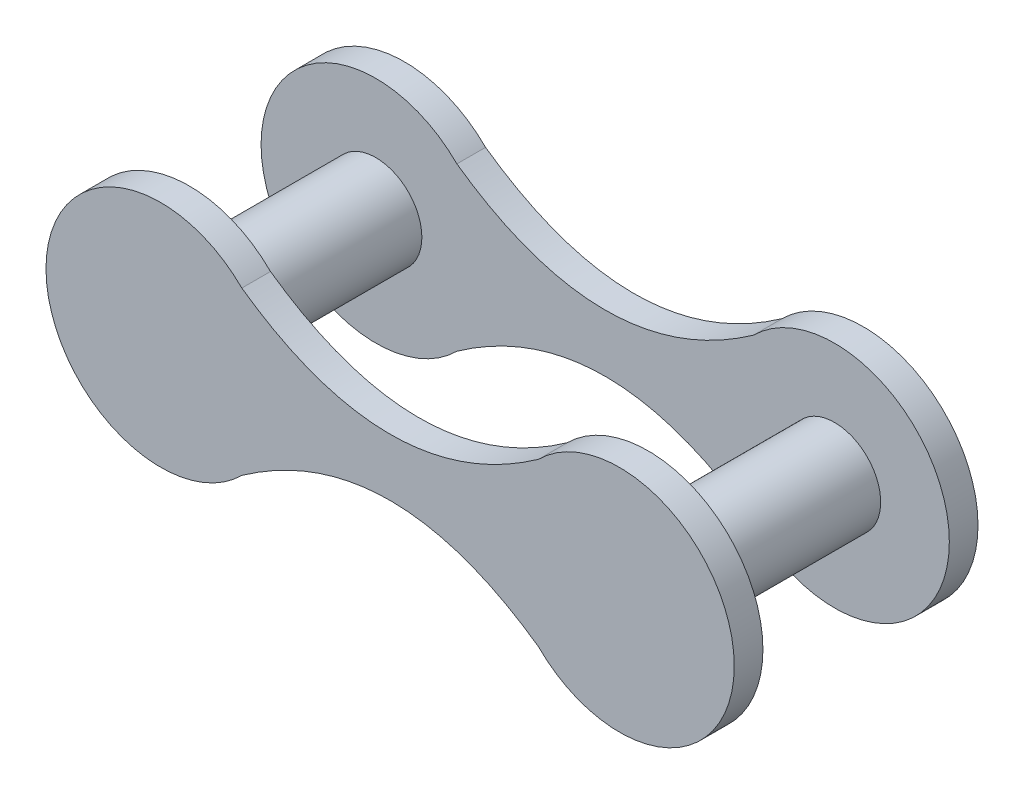
ISO-10303-21;
HEADER;
FILE_DESCRIPTION(('STEP AP214'),'2;1');
FILE_NAME('part.step','',(''),(''),'','','');
FILE_SCHEMA(('AUTOMOTIVE_DESIGN { 1 0 10303 214 1 1 1 1 }'));
ENDSEC;
DATA;
#1=APPLICATION_CONTEXT('core data for automotive mechanical design processes');
#2=APPLICATION_PROTOCOL_DEFINITION('international standard','automotive_design',2000,#1);
#3=PRODUCT_CONTEXT('',#1,'mechanical');
#4=PRODUCT('Part','Part','',(#3));
#5=PRODUCT_RELATED_PRODUCT_CATEGORY('part','',(#4));
#6=PRODUCT_DEFINITION_FORMATION('','',#4);
#7=PRODUCT_DEFINITION_CONTEXT('part definition',#1,'design');
#8=PRODUCT_DEFINITION('design','',#6,#7);
#9=PRODUCT_DEFINITION_SHAPE('','',#8);
#10=(LENGTH_UNIT() NAMED_UNIT(*) SI_UNIT(.MILLI.,.METRE.));
#11=(NAMED_UNIT(*) PLANE_ANGLE_UNIT() SI_UNIT($,.RADIAN.));
#12=(NAMED_UNIT(*) SI_UNIT($,.STERADIAN.) SOLID_ANGLE_UNIT());
#13=UNCERTAINTY_MEASURE_WITH_UNIT(LENGTH_MEASURE(1.E-05),#10,'distance_accuracy_value','');
#14=(GEOMETRIC_REPRESENTATION_CONTEXT(3) GLOBAL_UNCERTAINTY_ASSIGNED_CONTEXT((#13)) GLOBAL_UNIT_ASSIGNED_CONTEXT((#10,
#11,#12)) REPRESENTATION_CONTEXT('',''));
#15=CARTESIAN_POINT('',(0.,0.,0.));
#16=DIRECTION('',(0.,0.,1.));
#17=DIRECTION('',(1.,0.,0.));
#18=AXIS2_PLACEMENT_3D('',#15,#16,#17);
#19=CARTESIAN_POINT('',(4.10493596973271,2.24506403026729,0.79375));
#20=CARTESIAN_POINT('',(0.,-0.657564030267288,0.79375));
#21=CARTESIAN_POINT('',(-4.10493596973271,2.24506403026729,0.79375));
#22=B_SPLINE_CURVE_WITH_KNOTS('',2,(#19,#20,#21),.UNSPECIFIED.,.F.,.F.,(3,3),(0.,1.),.UNSPECIFIED.);
#23=DIRECTION('',(0.,0.,-1.));
#24=VECTOR('',#23,1.);
#25=SURFACE_OF_LINEAR_EXTRUSION('',#22,#24);
#26=CARTESIAN_POINT('',(4.10493596973271,2.24506403026729,0.));
#27=CARTESIAN_POINT('',(0.,-0.657564030267288,0.));
#28=CARTESIAN_POINT('',(-4.10493596973271,2.24506403026729,0.));
#29=B_SPLINE_CURVE_WITH_KNOTS('',2,(#26,#27,#28),.UNSPECIFIED.,.F.,.F.,(3,3),(0.,1.),.UNSPECIFIED.);
#30=CARTESIAN_POINT('',(4.10493596973271,2.24506403026729,0.));
#31=VERTEX_POINT('',#30);
#32=CARTESIAN_POINT('',(-4.10493596973271,2.24506403026729,0.));
#33=VERTEX_POINT('',#32);
#34=EDGE_CURVE('E198',#31,#33,#29,.T.);
#35=ORIENTED_EDGE('',*,*,#34,.T.);
#36=DIRECTION('',(0.,0.,-1.));
#37=VECTOR('',#36,1.);
#38=CARTESIAN_POINT('',(-4.10493596973271,2.24506403026729,0.79375));
#39=LINE('',#38,#37);
#40=CARTESIAN_POINT('',(-4.10493596973271,2.24506403026729,0.79375));
#41=VERTEX_POINT('',#40);
#42=EDGE_CURVE('E221',#41,#33,#39,.T.);
#43=ORIENTED_EDGE('',*,*,#42,.F.);
#44=CARTESIAN_POINT('',(4.10493596973271,2.24506403026729,0.79375));
#45=VERTEX_POINT('',#44);
#46=EDGE_CURVE('E216',#45,#41,#22,.T.);
#47=ORIENTED_EDGE('',*,*,#46,.F.);
#48=DIRECTION('',(0.,0.,-1.));
#49=VECTOR('',#48,1.);
#50=CARTESIAN_POINT('',(4.10493596973271,2.24506403026729,0.79375));
#51=LINE('',#50,#49);
#52=EDGE_CURVE('E197',#45,#31,#51,.T.);
#53=ORIENTED_EDGE('',*,*,#52,.T.);
#54=EDGE_LOOP('',(#35,#43,#47,#53));
#55=FACE_BOUND('',#54,.T.);
#56=ADVANCED_FACE('F37',(#55),#25,.F.);
#57=CARTESIAN_POINT('',(-6.35,0.,0.79375));
#58=DIRECTION('',(0.,0.,-1.));
#59=DIRECTION('',(-1.,0.,0.));
#60=AXIS2_PLACEMENT_3D('',#57,#58,#59);
#61=CYLINDRICAL_SURFACE('',#60,3.175);
#62=CARTESIAN_POINT('',(-6.35,0.,0.));
#63=DIRECTION('',(0.,0.,1.));
#64=DIRECTION('',(1.,0.,0.));
#65=AXIS2_PLACEMENT_3D('',#62,#63,#64);
#66=CIRCLE('',#65,3.175);
#67=CARTESIAN_POINT('',(-4.10493596973271,-2.24506403026729,0.));
#68=VERTEX_POINT('',#67);
#69=EDGE_CURVE('E203',#33,#68,#66,.T.);
#70=ORIENTED_EDGE('',*,*,#69,.T.);
#71=DIRECTION('',(0.,0.,-1.));
#72=VECTOR('',#71,1.);
#73=CARTESIAN_POINT('',(-4.10493596973271,-2.24506403026729,0.79375));
#74=LINE('',#73,#72);
#75=CARTESIAN_POINT('',(-4.10493596973271,-2.24506403026729,0.79375));
#76=VERTEX_POINT('',#75);
#77=EDGE_CURVE('E220',#76,#68,#74,.T.);
#78=ORIENTED_EDGE('',*,*,#77,.F.);
#79=CARTESIAN_POINT('',(-6.35,0.,0.79375));
#80=DIRECTION('',(0.,0.,1.));
#81=DIRECTION('',(1.,0.,0.));
#82=AXIS2_PLACEMENT_3D('',#79,#80,#81);
#83=CIRCLE('',#82,3.175);
#84=EDGE_CURVE('E86',#41,#76,#83,.T.);
#85=ORIENTED_EDGE('',*,*,#84,.F.);
#86=ORIENTED_EDGE('',*,*,#42,.T.);
#87=EDGE_LOOP('',(#70,#78,#85,#86));
#88=FACE_BOUND('',#87,.T.);
#89=ADVANCED_FACE('F186',(#88),#61,.T.);
#90=CARTESIAN_POINT('',(-4.10493596973271,-2.24506403026729,0.79375));
#91=CARTESIAN_POINT('',(0.,0.657564030267288,0.79375));
#92=CARTESIAN_POINT('',(4.10493596973271,-2.24506403026729,0.79375));
#93=B_SPLINE_CURVE_WITH_KNOTS('',2,(#90,#91,#92),.UNSPECIFIED.,.F.,.F.,(3,3),(0.,1.),.UNSPECIFIED.);
#94=DIRECTION('',(0.,0.,-1.));
#95=VECTOR('',#94,1.);
#96=SURFACE_OF_LINEAR_EXTRUSION('',#93,#95);
#97=CARTESIAN_POINT('',(-4.10493596973271,-2.24506403026729,0.));
#98=CARTESIAN_POINT('',(0.,0.657564030267288,0.));
#99=CARTESIAN_POINT('',(4.10493596973271,-2.24506403026729,0.));
#100=B_SPLINE_CURVE_WITH_KNOTS('',2,(#97,#98,#99),.UNSPECIFIED.,.F.,.F.,(3,3),(0.,1.),.UNSPECIFIED.);
#101=CARTESIAN_POINT('',(4.10493596973271,-2.24506403026729,0.));
#102=VERTEX_POINT('',#101);
#103=EDGE_CURVE('E72',#68,#102,#100,.T.);
#104=ORIENTED_EDGE('',*,*,#103,.T.);
#105=DIRECTION('',(0.,0.,-1.));
#106=VECTOR('',#105,1.);
#107=CARTESIAN_POINT('',(4.10493596973271,-2.24506403026729,0.79375));
#108=LINE('',#107,#106);
#109=CARTESIAN_POINT('',(4.10493596973271,-2.24506403026729,0.79375));
#110=VERTEX_POINT('',#109);
#111=EDGE_CURVE('E218',#110,#102,#108,.T.);
#112=ORIENTED_EDGE('',*,*,#111,.F.);
#113=EDGE_CURVE('E187',#76,#110,#93,.T.);
#114=ORIENTED_EDGE('',*,*,#113,.F.);
#115=ORIENTED_EDGE('',*,*,#77,.T.);
#116=EDGE_LOOP('',(#104,#112,#114,#115));
#117=FACE_BOUND('',#116,.T.);
#118=ADVANCED_FACE('F183',(#117),#96,.F.);
#119=CARTESIAN_POINT('',(6.35,0.,0.79375));
#120=DIRECTION('',(0.,0.,-1.));
#121=DIRECTION('',(-1.,0.,0.));
#122=AXIS2_PLACEMENT_3D('',#119,#120,#121);
#123=CYLINDRICAL_SURFACE('',#122,3.175);
#124=CARTESIAN_POINT('',(6.35,0.,0.));
#125=DIRECTION('',(0.,0.,1.));
#126=DIRECTION('',(1.,0.,0.));
#127=AXIS2_PLACEMENT_3D('',#124,#125,#126);
#128=CIRCLE('',#127,3.175);
#129=EDGE_CURVE('E78',#102,#31,#128,.T.);
#130=ORIENTED_EDGE('',*,*,#129,.T.);
#131=ORIENTED_EDGE('',*,*,#52,.F.);
#132=CARTESIAN_POINT('',(6.35,0.,0.79375));
#133=DIRECTION('',(0.,0.,1.));
#134=DIRECTION('',(1.,0.,0.));
#135=AXIS2_PLACEMENT_3D('',#132,#133,#134);
#136=CIRCLE('',#135,3.175);
#137=EDGE_CURVE('E54',#110,#45,#136,.T.);
#138=ORIENTED_EDGE('',*,*,#137,.F.);
#139=ORIENTED_EDGE('',*,*,#111,.T.);
#140=EDGE_LOOP('',(#130,#131,#138,#139));
#141=FACE_BOUND('',#140,.T.);
#142=ADVANCED_FACE('F176',(#141),#123,.T.);
#143=CARTESIAN_POINT('',(0.,0.79375,0.79375));
#144=DIRECTION('',(0.,0.,-1.));
#145=DIRECTION('',(-1.,0.,0.));
#146=AXIS2_PLACEMENT_3D('',#143,#144,#145);
#147=PLANE('',#146);
#148=CARTESIAN_POINT('',(6.35,0.,0.79375));
#149=DIRECTION('',(0.,0.,-1.));
#150=DIRECTION('',(-1.,0.,0.));
#151=AXIS2_PLACEMENT_3D('',#148,#149,#150);
#152=CIRCLE('',#151,1.27534342875423);
#153=CARTESIAN_POINT('',(5.07465657124577,0.,0.79375));
#154=VERTEX_POINT('',#153);
#155=EDGE_CURVE('E11',#154,#154,#152,.F.);
#156=ORIENTED_EDGE('',*,*,#155,.F.);
#157=EDGE_LOOP('',(#156));
#158=FACE_BOUND('',#157,.T.);
#159=CARTESIAN_POINT('',(-6.35,0.,0.79375));
#160=DIRECTION('',(0.,0.,1.));
#161=DIRECTION('',(1.,0.,0.));
#162=AXIS2_PLACEMENT_3D('',#159,#160,#161);
#163=CIRCLE('',#162,1.27534342875423);
#164=CARTESIAN_POINT('',(-5.07465657124577,0.,0.79375));
#165=VERTEX_POINT('',#164);
#166=EDGE_CURVE('E46',#165,#165,#163,.T.);
#167=ORIENTED_EDGE('',*,*,#166,.F.);
#168=EDGE_LOOP('',(#167));
#169=FACE_BOUND('',#168,.T.);
#170=ORIENTED_EDGE('',*,*,#46,.T.);
#171=ORIENTED_EDGE('',*,*,#84,.T.);
#172=ORIENTED_EDGE('',*,*,#113,.T.);
#173=ORIENTED_EDGE('',*,*,#137,.T.);
#174=EDGE_LOOP('',(#170,#171,#172,#173));
#175=FACE_BOUND('',#174,.T.);
#176=ADVANCED_FACE('F173',(#158,#169,#175),#147,.F.);
#177=CARTESIAN_POINT('',(0.,0.79375,0.));
#178=DIRECTION('',(0.,0.,-1.));
#179=DIRECTION('',(-1.,0.,0.));
#180=AXIS2_PLACEMENT_3D('',#177,#178,#179);
#181=PLANE('',#180);
#182=ORIENTED_EDGE('',*,*,#34,.F.);
#183=ORIENTED_EDGE('',*,*,#129,.F.);
#184=ORIENTED_EDGE('',*,*,#103,.F.);
#185=ORIENTED_EDGE('',*,*,#69,.F.);
#186=EDGE_LOOP('',(#182,#183,#184,#185));
#187=FACE_BOUND('',#186,.T.);
#188=ADVANCED_FACE('F171',(#187),#181,.T.);
#189=CARTESIAN_POINT('',(-6.35,0.,5.953125));
#190=DIRECTION('',(0.,0.,-1.));
#191=DIRECTION('',(-1.,0.,0.));
#192=AXIS2_PLACEMENT_3D('',#189,#190,#191);
#193=CYLINDRICAL_SURFACE('',#192,1.27534342875423);
#194=CARTESIAN_POINT('',(-6.35,0.,5.953125));
#195=DIRECTION('',(0.,0.,1.));
#196=DIRECTION('',(1.,0.,0.));
#197=AXIS2_PLACEMENT_3D('',#194,#195,#196);
#198=CIRCLE('',#197,1.27534342875423);
#199=CARTESIAN_POINT('',(-5.07465657124577,0.,5.953125));
#200=VERTEX_POINT('',#199);
#201=EDGE_CURVE('E204',#200,#200,#198,.T.);
#202=ORIENTED_EDGE('',*,*,#201,.F.);
#203=EDGE_LOOP('',(#202));
#204=FACE_BOUND('',#203,.T.);
#205=ORIENTED_EDGE('',*,*,#166,.T.);
#206=EDGE_LOOP('',(#205));
#207=FACE_BOUND('',#206,.T.);
#208=ADVANCED_FACE('F167',(#204,#207),#193,.T.);
#209=CARTESIAN_POINT('',(6.35,0.,5.953125));
#210=DIRECTION('',(0.,0.,-1.));
#211=DIRECTION('',(-1.,0.,0.));
#212=AXIS2_PLACEMENT_3D('',#209,#210,#211);
#213=CYLINDRICAL_SURFACE('',#212,1.27534342875423);
#214=CARTESIAN_POINT('',(6.35,0.,5.953125));
#215=DIRECTION('',(0.,0.,1.));
#216=DIRECTION('',(-1.,0.,0.));
#217=AXIS2_PLACEMENT_3D('',#214,#215,#216);
#218=CIRCLE('',#217,1.27534342875423);
#219=CARTESIAN_POINT('',(5.07465657124577,0.,5.953125));
#220=VERTEX_POINT('',#219);
#221=EDGE_CURVE('E124',#220,#220,#218,.T.);
#222=ORIENTED_EDGE('',*,*,#221,.F.);
#223=EDGE_LOOP('',(#222));
#224=FACE_BOUND('',#223,.T.);
#225=ORIENTED_EDGE('',*,*,#155,.T.);
#226=EDGE_LOOP('',(#225));
#227=FACE_BOUND('',#226,.T.);
#228=ADVANCED_FACE('F164',(#224,#227),#213,.T.);
#229=CARTESIAN_POINT('',(4.10493596973271,2.24506403026729,5.953125));
#230=CARTESIAN_POINT('',(0.,-0.657564030267288,5.953125));
#231=CARTESIAN_POINT('',(-4.10493596973271,2.24506403026729,5.953125));
#232=B_SPLINE_CURVE_WITH_KNOTS('',2,(#229,#230,#231),.UNSPECIFIED.,.F.,.F.,(3,3),(0.,1.),.UNSPECIFIED.);
#233=DIRECTION('',(0.,0.,1.));
#234=VECTOR('',#233,1.);
#235=SURFACE_OF_LINEAR_EXTRUSION('',#232,#234);
#236=CARTESIAN_POINT('',(4.10493596973271,2.24506403026729,6.746875));
#237=CARTESIAN_POINT('',(0.,-0.657564030267288,6.746875));
#238=CARTESIAN_POINT('',(-4.10493596973271,2.24506403026729,6.746875));
#239=B_SPLINE_CURVE_WITH_KNOTS('',2,(#236,#237,#238),.UNSPECIFIED.,.F.,.F.,(3,3),(0.,1.),.UNSPECIFIED.);
#240=CARTESIAN_POINT('',(4.10493596973271,2.24506403026729,6.746875));
#241=VERTEX_POINT('',#240);
#242=CARTESIAN_POINT('',(-4.10493596973271,2.24506403026729,6.746875));
#243=VERTEX_POINT('',#242);
#244=EDGE_CURVE('E119',#241,#243,#239,.T.);
#245=ORIENTED_EDGE('',*,*,#244,.F.);
#246=DIRECTION('',(0.,0.,1.));
#247=VECTOR('',#246,1.);
#248=CARTESIAN_POINT('',(4.10493596973271,2.24506403026729,5.953125));
#249=LINE('',#248,#247);
#250=CARTESIAN_POINT('',(4.10493596973271,2.24506403026729,5.953125));
#251=VERTEX_POINT('',#250);
#252=EDGE_CURVE('E113',#251,#241,#249,.T.);
#253=ORIENTED_EDGE('',*,*,#252,.F.);
#254=CARTESIAN_POINT('',(-4.10493596973271,2.24506403026729,5.953125));
#255=VERTEX_POINT('',#254);
#256=EDGE_CURVE('E116',#251,#255,#232,.T.);
#257=ORIENTED_EDGE('',*,*,#256,.T.);
#258=DIRECTION('',(0.,0.,1.));
#259=VECTOR('',#258,1.);
#260=CARTESIAN_POINT('',(-4.10493596973271,2.24506403026729,5.953125));
#261=LINE('',#260,#259);
#262=EDGE_CURVE('E337',#255,#243,#261,.T.);
#263=ORIENTED_EDGE('',*,*,#262,.T.);
#264=EDGE_LOOP('',(#245,#253,#257,#263));
#265=FACE_BOUND('',#264,.T.);
#266=ADVANCED_FACE('F115',(#265),#235,.T.);
#267=CARTESIAN_POINT('',(6.35,0.,5.953125));
#268=DIRECTION('',(0.,0.,1.));
#269=DIRECTION('',(1.,0.,0.));
#270=AXIS2_PLACEMENT_3D('',#267,#268,#269);
#271=CYLINDRICAL_SURFACE('',#270,3.175);
#272=CARTESIAN_POINT('',(6.35,0.,6.746875));
#273=DIRECTION('',(0.,0.,1.));
#274=DIRECTION('',(1.,0.,0.));
#275=AXIS2_PLACEMENT_3D('',#272,#273,#274);
#276=CIRCLE('',#275,3.175);
#277=CARTESIAN_POINT('',(4.10493596973271,-2.24506403026729,6.746875));
#278=VERTEX_POINT('',#277);
#279=EDGE_CURVE('E336',#278,#241,#276,.T.);
#280=ORIENTED_EDGE('',*,*,#279,.F.);
#281=DIRECTION('',(0.,0.,1.));
#282=VECTOR('',#281,1.);
#283=CARTESIAN_POINT('',(4.10493596973271,-2.24506403026729,5.953125));
#284=LINE('',#283,#282);
#285=CARTESIAN_POINT('',(4.10493596973271,-2.24506403026729,5.953125));
#286=VERTEX_POINT('',#285);
#287=EDGE_CURVE('E125',#286,#278,#284,.T.);
#288=ORIENTED_EDGE('',*,*,#287,.F.);
#289=CARTESIAN_POINT('',(6.35,0.,5.953125));
#290=DIRECTION('',(0.,0.,1.));
#291=DIRECTION('',(1.,0.,0.));
#292=AXIS2_PLACEMENT_3D('',#289,#290,#291);
#293=CIRCLE('',#292,3.175);
#294=EDGE_CURVE('E131',#286,#251,#293,.T.);
#295=ORIENTED_EDGE('',*,*,#294,.T.);
#296=ORIENTED_EDGE('',*,*,#252,.T.);
#297=EDGE_LOOP('',(#280,#288,#295,#296));
#298=FACE_BOUND('',#297,.T.);
#299=ADVANCED_FACE('F137',(#298),#271,.T.);
#300=CARTESIAN_POINT('',(-4.10493596973271,-2.24506403026729,5.953125));
#301=CARTESIAN_POINT('',(0.,0.657564030267288,5.953125));
#302=CARTESIAN_POINT('',(4.10493596973271,-2.24506403026729,5.953125));
#303=B_SPLINE_CURVE_WITH_KNOTS('',2,(#300,#301,#302),.UNSPECIFIED.,.F.,.F.,(3,3),(0.,1.),.UNSPECIFIED.);
#304=DIRECTION('',(0.,0.,1.));
#305=VECTOR('',#304,1.);
#306=SURFACE_OF_LINEAR_EXTRUSION('',#303,#305);
#307=CARTESIAN_POINT('',(-4.10493596973271,-2.24506403026729,6.746875));
#308=CARTESIAN_POINT('',(0.,0.657564030267288,6.746875));
#309=CARTESIAN_POINT('',(4.10493596973271,-2.24506403026729,6.746875));
#310=B_SPLINE_CURVE_WITH_KNOTS('',2,(#307,#308,#309),.UNSPECIFIED.,.F.,.F.,(3,3),(0.,1.),.UNSPECIFIED.);
#311=CARTESIAN_POINT('',(-4.10493596973271,-2.24506403026729,6.746875));
#312=VERTEX_POINT('',#311);
#313=EDGE_CURVE('E340',#312,#278,#310,.T.);
#314=ORIENTED_EDGE('',*,*,#313,.F.);
#315=DIRECTION('',(0.,0.,1.));
#316=VECTOR('',#315,1.);
#317=CARTESIAN_POINT('',(-4.10493596973271,-2.24506403026729,5.953125));
#318=LINE('',#317,#316);
#319=CARTESIAN_POINT('',(-4.10493596973271,-2.24506403026729,5.953125));
#320=VERTEX_POINT('',#319);
#321=EDGE_CURVE('E338',#320,#312,#318,.T.);
#322=ORIENTED_EDGE('',*,*,#321,.F.);
#323=EDGE_CURVE('E138',#320,#286,#303,.T.);
#324=ORIENTED_EDGE('',*,*,#323,.T.);
#325=ORIENTED_EDGE('',*,*,#287,.T.);
#326=EDGE_LOOP('',(#314,#322,#324,#325));
#327=FACE_BOUND('',#326,.T.);
#328=ADVANCED_FACE('F153',(#327),#306,.T.);
#329=CARTESIAN_POINT('',(-6.35,0.,5.953125));
#330=DIRECTION('',(0.,0.,1.));
#331=DIRECTION('',(1.,0.,0.));
#332=AXIS2_PLACEMENT_3D('',#329,#330,#331);
#333=CYLINDRICAL_SURFACE('',#332,3.175);
#334=CARTESIAN_POINT('',(-6.35,0.,6.746875));
#335=DIRECTION('',(0.,0.,1.));
#336=DIRECTION('',(1.,0.,0.));
#337=AXIS2_PLACEMENT_3D('',#334,#335,#336);
#338=CIRCLE('',#337,3.175);
#339=EDGE_CURVE('E135',#243,#312,#338,.T.);
#340=ORIENTED_EDGE('',*,*,#339,.F.);
#341=ORIENTED_EDGE('',*,*,#262,.F.);
#342=CARTESIAN_POINT('',(-6.35,0.,5.953125));
#343=DIRECTION('',(0.,0.,1.));
#344=DIRECTION('',(1.,0.,0.));
#345=AXIS2_PLACEMENT_3D('',#342,#343,#344);
#346=CIRCLE('',#345,3.175);
#347=EDGE_CURVE('E134',#255,#320,#346,.T.);
#348=ORIENTED_EDGE('',*,*,#347,.T.);
#349=ORIENTED_EDGE('',*,*,#321,.T.);
#350=EDGE_LOOP('',(#340,#341,#348,#349));
#351=FACE_BOUND('',#350,.T.);
#352=ADVANCED_FACE('F157',(#351),#333,.T.);
#353=CARTESIAN_POINT('',(0.,0.79375,5.953125));
#354=DIRECTION('',(0.,0.,1.));
#355=DIRECTION('',(-1.,0.,0.));
#356=AXIS2_PLACEMENT_3D('',#353,#354,#355);
#357=PLANE('',#356);
#358=ORIENTED_EDGE('',*,*,#201,.T.);
#359=EDGE_LOOP('',(#358));
#360=FACE_BOUND('',#359,.T.);
#361=ORIENTED_EDGE('',*,*,#221,.T.);
#362=EDGE_LOOP('',(#361));
#363=FACE_BOUND('',#362,.T.);
#364=ORIENTED_EDGE('',*,*,#256,.F.);
#365=ORIENTED_EDGE('',*,*,#294,.F.);
#366=ORIENTED_EDGE('',*,*,#323,.F.);
#367=ORIENTED_EDGE('',*,*,#347,.F.);
#368=EDGE_LOOP('',(#364,#365,#366,#367));
#369=FACE_BOUND('',#368,.T.);
#370=ADVANCED_FACE('F129',(#360,#363,#369),#357,.F.);
#371=CARTESIAN_POINT('',(0.,0.79375,6.746875));
#372=DIRECTION('',(0.,0.,1.));
#373=DIRECTION('',(-1.,0.,0.));
#374=AXIS2_PLACEMENT_3D('',#371,#372,#373);
#375=PLANE('',#374);
#376=ORIENTED_EDGE('',*,*,#244,.T.);
#377=ORIENTED_EDGE('',*,*,#339,.T.);
#378=ORIENTED_EDGE('',*,*,#313,.T.);
#379=ORIENTED_EDGE('',*,*,#279,.T.);
#380=EDGE_LOOP('',(#376,#377,#378,#379));
#381=FACE_BOUND('',#380,.T.);
#382=ADVANCED_FACE('F293',(#381),#375,.T.);
#383=CLOSED_SHELL('',(#56,#89,#118,#142,#176,#188,#208,#228,#266,#299,#328,#352,#370,#382));
#384=MANIFOLD_SOLID_BREP('B2',#383);
#385=ADVANCED_BREP_SHAPE_REPRESENTATION('',(#18,#384),#14);
#386=SHAPE_DEFINITION_REPRESENTATION(#9,#385);
ENDSEC;
END-ISO-10303-21;
